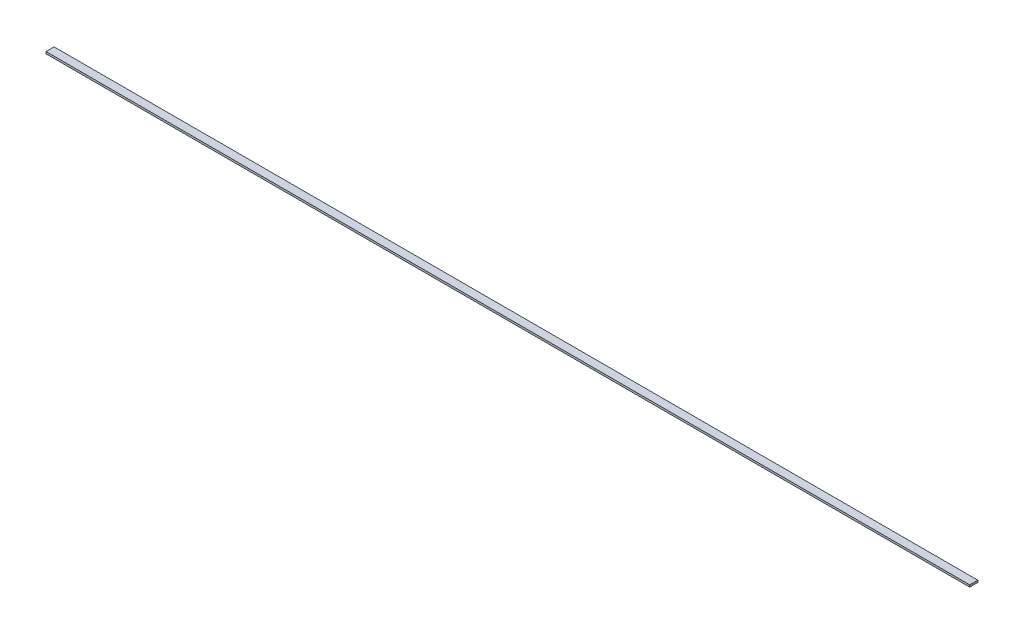
ISO-10303-21;
HEADER;
FILE_DESCRIPTION(('STEP AP214'),'2;1');
FILE_NAME('part.step','',(''),(''),'','','');
FILE_SCHEMA(('AUTOMOTIVE_DESIGN { 1 0 10303 214 1 1 1 1 }'));
ENDSEC;
DATA;
#1=APPLICATION_CONTEXT('core data for automotive mechanical design processes');
#2=APPLICATION_PROTOCOL_DEFINITION('international standard','automotive_design',2000,#1);
#3=PRODUCT_CONTEXT('',#1,'mechanical');
#4=PRODUCT('Part','Part','',(#3));
#5=PRODUCT_RELATED_PRODUCT_CATEGORY('part','',(#4));
#6=PRODUCT_DEFINITION_FORMATION('','',#4);
#7=PRODUCT_DEFINITION_CONTEXT('part definition',#1,'design');
#8=PRODUCT_DEFINITION('design','',#6,#7);
#9=PRODUCT_DEFINITION_SHAPE('','',#8);
#10=(LENGTH_UNIT() NAMED_UNIT(*) SI_UNIT(.MILLI.,.METRE.));
#11=(NAMED_UNIT(*) PLANE_ANGLE_UNIT() SI_UNIT($,.RADIAN.));
#12=(NAMED_UNIT(*) SI_UNIT($,.STERADIAN.) SOLID_ANGLE_UNIT());
#13=UNCERTAINTY_MEASURE_WITH_UNIT(LENGTH_MEASURE(1.E-05),#10,'distance_accuracy_value','');
#14=(GEOMETRIC_REPRESENTATION_CONTEXT(3) GLOBAL_UNCERTAINTY_ASSIGNED_CONTEXT((#13)) GLOBAL_UNIT_ASSIGNED_CONTEXT((#10,
#11,#12)) REPRESENTATION_CONTEXT('',''));
#15=CARTESIAN_POINT('',(0.,0.,0.));
#16=DIRECTION('',(0.,0.,1.));
#17=DIRECTION('',(1.,0.,0.));
#18=AXIS2_PLACEMENT_3D('',#15,#16,#17);
#19=CARTESIAN_POINT('',(0.,1.49711132773622,0.435092083404368));
#20=DIRECTION('',(-1.,0.,0.));
#21=DIRECTION('',(0.,0.,1.));
#22=AXIS2_PLACEMENT_3D('',#19,#20,#21);
#23=PLANE('',#22);
#24=CARTESIAN_POINT('',(0.,0.,250.));
#25=CARTESIAN_POINT('',(0.,-0.0080427959719715,250.000228293678));
#26=CARTESIAN_POINT('',(0.,0.172375657967406,248.284955515532));
#27=CARTESIAN_POINT('',(0.,0.308690014795419,246.518112419387));
#28=CARTESIAN_POINT('',(0.,0.685693593852336,242.189387343398));
#29=CARTESIAN_POINT('',(0.,1.07410152891603,236.806461263496));
#30=CARTESIAN_POINT('',(0.,1.49731723995003,229.680385951639));
#31=CARTESIAN_POINT('',(0.,1.8232186026768,221.18415869828));
#32=CARTESIAN_POINT('',(0.,1.96762610068065,211.337618207726));
#33=CARTESIAN_POINT('',(0.,1.83322105638369,200.371188527109));
#34=CARTESIAN_POINT('',(0.,1.38960528984164,188.499913622482));
#35=CARTESIAN_POINT('',(0.,0.706014078000893,175.953687417433));
#36=CARTESIAN_POINT('',(0.,-0.160208641561513,162.931424917666));
#37=CARTESIAN_POINT('',(0.,-1.14801632724376,149.615771743617));
#38=CARTESIAN_POINT('',(0.,-2.19092490983926,136.176354994724));
#39=CARTESIAN_POINT('',(0.,-3.21958397917046,122.767140548026));
#40=CARTESIAN_POINT('',(0.,-4.15274312671142,109.520053587455));
#41=CARTESIAN_POINT('',(0.,-4.93856436487493,96.5460959745437));
#42=CARTESIAN_POINT('',(0.,-5.53683070268675,83.9408193016427));
#43=CARTESIAN_POINT('',(0.,-5.94764820461108,71.8018392906514));
#44=CARTESIAN_POINT('',(0.,-6.21845093878312,60.2452560030716));
#45=CARTESIAN_POINT('',(0.,-6.35536975583973,49.3987328907547));
#46=CARTESIAN_POINT('',(0.,-6.38138796281789,39.3972261942655));
#47=CARTESIAN_POINT('',(0.,-6.26504923032313,30.3619348419668));
#48=CARTESIAN_POINT('',(0.,-6.01216491688521,22.4121811031587));
#49=CARTESIAN_POINT('',(0.,-5.59743390072595,15.6262272306516));
#50=CARTESIAN_POINT('',(0.,-4.92870657935606,10.0719075109048));
#51=CARTESIAN_POINT('',(0.,-4.04044698146404,5.69769261214423));
#52=CARTESIAN_POINT('',(0.,-2.8657529844069,2.62532063874475));
#53=CARTESIAN_POINT('',(0.,-1.7115284699546,0.494884225045661));
#54=CARTESIAN_POINT('',(0.,-0.410454230626488,-0.0213125491030087));
#55=CARTESIAN_POINT('',(0.,0.792659826704065,0.0311691995850224));
#56=CARTESIAN_POINT('',(0.,2.30568433693192,0.812599241892923));
#57=CARTESIAN_POINT('',(0.,4.23835242447377,2.72886351673443));
#58=CARTESIAN_POINT('',(0.,6.11817212106947,5.76990724125498));
#59=CARTESIAN_POINT('',(0.,7.91359420170391,9.88094280419771));
#60=CARTESIAN_POINT('',(0.,9.64131817838287,15.0749304677094));
#61=CARTESIAN_POINT('',(0.,11.2838964878058,21.2987522216172));
#62=CARTESIAN_POINT('',(0.,12.7883817585812,28.4971721202648));
#63=CARTESIAN_POINT('',(0.,14.0978349081275,36.6073734062479));
#64=CARTESIAN_POINT('',(0.,15.1594290171638,45.573028440303));
#65=CARTESIAN_POINT('',(0.,15.9609039979753,55.3329100744701));
#66=CARTESIAN_POINT('',(0.,16.4940697383882,65.8165364983871));
#67=CARTESIAN_POINT('',(0.,16.7919897051422,76.9313762604552));
#68=CARTESIAN_POINT('',(0.,16.864754130909,88.5669490281142));
#69=CARTESIAN_POINT('',(0.,16.7267152914356,100.596999885542));
#70=CARTESIAN_POINT('',(0.,16.3833850637257,112.888825982424));
#71=CARTESIAN_POINT('',(0.,15.825573666627,125.31161581915));
#72=CARTESIAN_POINT('',(0.,15.0523318700684,137.743791097076));
#73=CARTESIAN_POINT('',(0.,14.0593390742259,150.072384382085));
#74=CARTESIAN_POINT('',(0.,12.8815869860292,162.191375055682));
#75=CARTESIAN_POINT('',(0.,11.5492803460744,173.989074322246));
#76=CARTESIAN_POINT('',(0.,10.1162497290333,185.35236444642));
#77=CARTESIAN_POINT('',(0.,8.63237912523508,196.163081697706));
#78=CARTESIAN_POINT('',(0.,7.13151388385034,206.300441402258));
#79=CARTESIAN_POINT('',(0.,5.73122176805054,215.560350587015));
#80=CARTESIAN_POINT('',(0.,4.29329512716244,223.97715704258));
#81=CARTESIAN_POINT('',(0.,3.1818088737293,231.363413336396));
#82=CARTESIAN_POINT('',(0.,2.09894241729889,237.746440904332));
#83=CARTESIAN_POINT('',(0.,1.2458619166603,242.622069365861));
#84=CARTESIAN_POINT('',(0.,0.552864946230777,246.64452933247));
#85=CARTESIAN_POINT('',(0.,0.246216764640028,248.328398440367));
#86=CARTESIAN_POINT('',(0.,0.00797737724443801,249.999773563223));
#87=CARTESIAN_POINT('',(0.,0.,250.));
#88=B_SPLINE_CURVE_WITH_KNOTS('',3,(#24,#25,#26,#27,#28,#29,#30,#31,#32,#33,#34,#35,#36,#37,#38,
#39,#40,#41,#42,#43,#44,#45,#46,#47,#48,#49,#50,#51,#52,#53,#54,#55,#56,#57,#58,#59,#60,#61,#62,
#63,#64,#65,#66,#67,#68,#69,#70,#71,#72,#73,#74,#75,#76,#77,#78,#79,#80,#81,#82,#83,#84,#85,#86,
#87),.UNSPECIFIED.,.T.,.F.,(4,1,1,1,1,1,1,1,1,1,1,1,1,1,1,1,1,1,1,1,1,1,1,1,1,1,1,1,1,1,1,1,1,1,
1,1,1,1,1,1,1,1,1,1,1,1,1,1,1,1,1,1,1,1,1,1,1,1,1,1,1,4),(0.,0.00158888881614516,
0.00632921783555629,0.0142024564897436,0.0251728077530557,0.0391734833267743,0.0560606311759249,
0.0755789238487882,0.0973636066296903,0.120926258366677,0.145825281006277,0.171670911815127,
0.198108536705041,0.22479018357162,0.25139057978404,0.277643490654311,0.303326750051388,
0.328257458029316,0.352272548115194,0.375156061746876,0.396620664402003,0.416422729294005,
0.434304420097656,0.450054679859308,0.463465465082325,0.474478994238096,0.483169222153171,
0.489678354497499,0.494104066315722,0.496910015324886,0.497289784891853,0.501214273282496,
0.506457950332762,0.51335695674223,0.522168631834455,0.53296596992453,0.545689209241574,
0.56022077890382,0.57643892310517,0.594258689005965,0.613600244568652,0.634342385932902,
0.656331109263004,0.679351893859712,0.703152302846811,0.727478208080039,0.7520707394079,
0.776691163534608,0.801140183976245,0.825214386971546,0.848697423570622,0.871352857669295,
0.892947448931157,0.913230871058069,0.931955467148994,0.94834206907442,0.963693004275676,
0.976235918239566,0.986320058750392,0.993788799349345,0.998424034933867,1.),.UNSPECIFIED.);
#89=CARTESIAN_POINT('',(0.,-1.00001216278874,0.266541428387411));
#90=VERTEX_POINT('',#89);
#91=CARTESIAN_POINT('',(0.,0.999987837209787,0.201511969330149));
#92=VERTEX_POINT('',#91);
#93=EDGE_CURVE('E11',#90,#92,#88,.T.);
#94=ORIENTED_EDGE('',*,*,#93,.F.);
#95=DIRECTION('',(0.,0.,-1.));
#96=VECTOR('',#95,1.);
#97=CARTESIAN_POINT('',(0.,-1.00001216278875,8.19991970488098));
#98=LINE('',#97,#96);
#99=CARTESIAN_POINT('',(0.,-1.00001216278875,8.19991970488098));
#100=VERTEX_POINT('',#99);
#101=EDGE_CURVE('E69',#100,#90,#98,.T.);
#102=ORIENTED_EDGE('',*,*,#101,.F.);
#103=DIRECTION('',(0.,-1.,0.));
#104=VECTOR('',#103,1.);
#105=CARTESIAN_POINT('',(0.,0.999987837211251,8.19991970488098));
#106=LINE('',#105,#104);
#107=CARTESIAN_POINT('',(0.,0.999987837211251,8.19991970488098));
#108=VERTEX_POINT('',#107);
#109=EDGE_CURVE('E88',#108,#100,#106,.T.);
#110=ORIENTED_EDGE('',*,*,#109,.F.);
#111=DIRECTION('',(0.,0.,1.));
#112=VECTOR('',#111,1.);
#113=CARTESIAN_POINT('',(0.,0.999987837211251,8.19991970488098));
#114=LINE('',#113,#112);
#115=EDGE_CURVE('E125',#92,#108,#114,.T.);
#116=ORIENTED_EDGE('',*,*,#115,.F.);
#117=EDGE_LOOP('',(#94,#102,#110,#116));
#118=FACE_BOUND('',#117,.T.);
#119=ADVANCED_FACE('F34',(#118),#23,.T.);
#120=CARTESIAN_POINT('',(5.,0.,250.));
#121=CARTESIAN_POINT('',(5.,-0.0080427959719715,250.000228293678));
#122=CARTESIAN_POINT('',(5.,0.172375657967406,248.284955515532));
#123=CARTESIAN_POINT('',(5.,0.308690014795419,246.518112419387));
#124=CARTESIAN_POINT('',(5.,0.685693593852336,242.189387343398));
#125=CARTESIAN_POINT('',(5.,1.07410152891603,236.806461263496));
#126=CARTESIAN_POINT('',(5.,1.49731723995003,229.680385951639));
#127=CARTESIAN_POINT('',(5.,1.8232186026768,221.18415869828));
#128=CARTESIAN_POINT('',(5.,1.96762610068065,211.337618207726));
#129=CARTESIAN_POINT('',(5.,1.83322105638369,200.371188527109));
#130=CARTESIAN_POINT('',(5.,1.38960528984164,188.499913622482));
#131=CARTESIAN_POINT('',(5.,0.706014078000893,175.953687417433));
#132=CARTESIAN_POINT('',(5.,-0.160208641561513,162.931424917666));
#133=CARTESIAN_POINT('',(5.,-1.14801632724376,149.615771743617));
#134=CARTESIAN_POINT('',(5.,-2.19092490983926,136.176354994724));
#135=CARTESIAN_POINT('',(5.,-3.21958397917046,122.767140548026));
#136=CARTESIAN_POINT('',(5.,-4.15274312671142,109.520053587455));
#137=CARTESIAN_POINT('',(5.,-4.93856436487493,96.5460959745437));
#138=CARTESIAN_POINT('',(5.,-5.53683070268675,83.9408193016427));
#139=CARTESIAN_POINT('',(5.,-5.94764820461108,71.8018392906514));
#140=CARTESIAN_POINT('',(5.,-6.21845093878312,60.2452560030716));
#141=CARTESIAN_POINT('',(5.,-6.35536975583973,49.3987328907547));
#142=CARTESIAN_POINT('',(5.,-6.38138796281789,39.3972261942655));
#143=CARTESIAN_POINT('',(5.,-6.26504923032313,30.3619348419668));
#144=CARTESIAN_POINT('',(5.,-6.01216491688521,22.4121811031587));
#145=CARTESIAN_POINT('',(5.,-5.59743390072595,15.6262272306516));
#146=CARTESIAN_POINT('',(5.,-4.92870657935606,10.0719075109048));
#147=CARTESIAN_POINT('',(5.,-4.04044698146404,5.69769261214423));
#148=CARTESIAN_POINT('',(5.,-2.8657529844069,2.62532063874475));
#149=CARTESIAN_POINT('',(5.,-1.7115284699546,0.494884225045661));
#150=CARTESIAN_POINT('',(5.,-0.410454230626488,-0.0213125491030087));
#151=CARTESIAN_POINT('',(5.,0.792659826704065,0.0311691995850224));
#152=CARTESIAN_POINT('',(5.,2.30568433693192,0.812599241892923));
#153=CARTESIAN_POINT('',(5.,4.23835242447377,2.72886351673443));
#154=CARTESIAN_POINT('',(5.,6.11817212106947,5.76990724125498));
#155=CARTESIAN_POINT('',(5.,7.91359420170391,9.88094280419771));
#156=CARTESIAN_POINT('',(5.,9.64131817838287,15.0749304677094));
#157=CARTESIAN_POINT('',(5.,11.2838964878058,21.2987522216172));
#158=CARTESIAN_POINT('',(5.,12.7883817585812,28.4971721202648));
#159=CARTESIAN_POINT('',(5.,14.0978349081275,36.6073734062479));
#160=CARTESIAN_POINT('',(5.,15.1594290171638,45.573028440303));
#161=CARTESIAN_POINT('',(5.,15.9609039979753,55.3329100744701));
#162=CARTESIAN_POINT('',(5.,16.4940697383882,65.8165364983871));
#163=CARTESIAN_POINT('',(5.,16.7919897051422,76.9313762604552));
#164=CARTESIAN_POINT('',(5.,16.864754130909,88.5669490281142));
#165=CARTESIAN_POINT('',(5.,16.7267152914356,100.596999885542));
#166=CARTESIAN_POINT('',(5.,16.3833850637257,112.888825982424));
#167=CARTESIAN_POINT('',(5.,15.825573666627,125.31161581915));
#168=CARTESIAN_POINT('',(5.,15.0523318700684,137.743791097076));
#169=CARTESIAN_POINT('',(5.,14.0593390742259,150.072384382085));
#170=CARTESIAN_POINT('',(5.,12.8815869860292,162.191375055682));
#171=CARTESIAN_POINT('',(5.,11.5492803460744,173.989074322246));
#172=CARTESIAN_POINT('',(5.,10.1162497290333,185.35236444642));
#173=CARTESIAN_POINT('',(5.,8.63237912523508,196.163081697706));
#174=CARTESIAN_POINT('',(5.,7.13151388385034,206.300441402258));
#175=CARTESIAN_POINT('',(5.,5.73122176805054,215.560350587015));
#176=CARTESIAN_POINT('',(5.,4.29329512716244,223.97715704258));
#177=CARTESIAN_POINT('',(5.,3.1818088737293,231.363413336396));
#178=CARTESIAN_POINT('',(5.,2.09894241729889,237.746440904332));
#179=CARTESIAN_POINT('',(5.,1.2458619166603,242.622069365861));
#180=CARTESIAN_POINT('',(5.,0.552864946230777,246.64452933247));
#181=CARTESIAN_POINT('',(5.,0.246216764640028,248.328398440367));
#182=CARTESIAN_POINT('',(5.,0.00797737724443801,249.999773563223));
#183=CARTESIAN_POINT('',(5.,0.,250.));
#184=B_SPLINE_CURVE_WITH_KNOTS('',3,(#120,#121,#122,#123,#124,#125,#126,#127,#128,#129,#130,
#131,#132,#133,#134,#135,#136,#137,#138,#139,#140,#141,#142,#143,#144,#145,#146,#147,#148,#149,
#150,#151,#152,#153,#154,#155,#156,#157,#158,#159,#160,#161,#162,#163,#164,#165,#166,#167,#168,
#169,#170,#171,#172,#173,#174,#175,#176,#177,#178,#179,#180,#181,#182,#183),.UNSPECIFIED.,.T.,
.F.,(4,1,1,1,1,1,1,1,1,1,1,1,1,1,1,1,1,1,1,1,1,1,1,1,1,1,1,1,1,1,1,1,1,1,1,1,1,1,1,1,1,1,1,1,1,
1,1,1,1,1,1,1,1,1,1,1,1,1,1,1,1,4),(0.,0.00158888881614516,0.00632921783555629,
0.0142024564897436,0.0251728077530557,0.0391734833267743,0.0560606311759249,0.0755789238487882,
0.0973636066296903,0.120926258366677,0.145825281006277,0.171670911815127,0.198108536705041,
0.22479018357162,0.25139057978404,0.277643490654311,0.303326750051388,0.328257458029316,
0.352272548115194,0.375156061746876,0.396620664402003,0.416422729294005,0.434304420097656,
0.450054679859308,0.463465465082325,0.474478994238096,0.483169222153171,0.489678354497499,
0.494104066315722,0.496910015324886,0.497289784891853,0.501214273282496,0.506457950332762,
0.51335695674223,0.522168631834455,0.53296596992453,0.545689209241574,0.56022077890382,
0.57643892310517,0.594258689005965,0.613600244568652,0.634342385932902,0.656331109263004,
0.679351893859712,0.703152302846811,0.727478208080039,0.7520707394079,0.776691163534608,
0.801140183976245,0.825214386971546,0.848697423570622,0.871352857669295,0.892947448931157,
0.913230871058069,0.931955467148994,0.94834206907442,0.963693004275676,0.976235918239566,
0.986320058750392,0.993788799349345,0.998424034933867,1.),.UNSPECIFIED.);
#185=DIRECTION('',(-1.,0.,0.));
#186=VECTOR('',#185,1.);
#187=SURFACE_OF_LINEAR_EXTRUSION('',#184,#186);
#188=DIRECTION('',(-1.,0.,0.));
#189=VECTOR('',#188,1.);
#190=CARTESIAN_POINT('',(2.5,-1.00001216278874,0.266541428387411));
#191=LINE('',#190,#189);
#192=CARTESIAN_POINT('',(915.,-1.00001216278864,0.266541428387357));
#193=VERTEX_POINT('',#192);
#194=EDGE_CURVE('E80',#90,#193,#191,.F.);
#195=ORIENTED_EDGE('',*,*,#194,.F.);
#196=ORIENTED_EDGE('',*,*,#93,.T.);
#197=DIRECTION('',(-1.,0.,0.));
#198=VECTOR('',#197,1.);
#199=CARTESIAN_POINT('',(2.5,0.999987837211269,0.201511969330724));
#200=LINE('',#199,#198);
#201=CARTESIAN_POINT('',(915.,0.999987837210289,0.201511969330344));
#202=VERTEX_POINT('',#201);
#203=EDGE_CURVE('E52',#92,#202,#200,.F.);
#204=ORIENTED_EDGE('',*,*,#203,.T.);
#205=CARTESIAN_POINT('',(915.,-1.00001216278864,0.266541428387357));
#206=CARTESIAN_POINT('',(915.,-0.96352854643699,0.24739636345769));
#207=CARTESIAN_POINT('',(915.,-0.926583590938244,0.229124480074609));
#208=CARTESIAN_POINT('',(915.,-0.851788545044796,0.194394820209712));
#209=CARTESIAN_POINT('',(915.,-0.813937265806537,0.177939605491571));
#210=CARTESIAN_POINT('',(915.,-0.737430451592456,0.146957307169961));
#211=CARTESIAN_POINT('',(915.,-0.698774533117779,0.13243116850468));
#212=CARTESIAN_POINT('',(915.,-0.621146378982343,0.105562193098103));
#213=CARTESIAN_POINT('',(915.,-0.582181257604548,0.0931988278713369));
#214=CARTESIAN_POINT('',(915.,-0.503650112550171,0.0706001608430065));
#215=CARTESIAN_POINT('',(915.,-0.464084301229766,0.0603641249568602));
#216=CARTESIAN_POINT('',(915.,-0.384447924589305,0.0421458779926837));
#217=CARTESIAN_POINT('',(915.,-0.344377454093007,0.0341632499169644));
#218=CARTESIAN_POINT('',(915.,-0.243082034002305,0.0170951854629961));
#219=CARTESIAN_POINT('',(915.,-0.181582490849863,0.00955625990358863));
#220=CARTESIAN_POINT('',(915.,-0.0890245478732348,0.00272742579941516));
#221=CARTESIAN_POINT('',(915.,-0.0581168723712811,0.00119782233074786));
#222=CARTESIAN_POINT('',(915.,0.00373820184295657,-0.000285710361649545));
#223=CARTESIAN_POINT('',(915.,0.0346855992619639,-0.000239689645806044));
#224=CARTESIAN_POINT('',(915.,0.096629856029956,0.00130635941642704));
#225=CARTESIAN_POINT('',(915.,0.127626597772657,0.00281061268642056));
#226=CARTESIAN_POINT('',(915.,0.18953687044619,0.00704801214719235));
#227=CARTESIAN_POINT('',(915.,0.220450392905355,0.00978127902079081));
#228=CARTESIAN_POINT('',(915.,0.282164426709342,0.0163904863433376));
#229=CARTESIAN_POINT('',(915.,0.312964900416234,0.0202667775943579));
#230=CARTESIAN_POINT('',(915.,0.374401670074106,0.0291298958696311));
#231=CARTESIAN_POINT('',(915.,0.405037980689386,0.0341166219489025));
#232=CARTESIAN_POINT('',(915.,0.483966177562081,0.0483771399907087));
#233=CARTESIAN_POINT('',(915.,0.532114744218726,0.0584533607457297));
#234=CARTESIAN_POINT('',(915.,0.627806191878603,0.0810742880715991));
#235=CARTESIAN_POINT('',(915.,0.675349271638863,0.0936181611470678));
#236=CARTESIAN_POINT('',(915.,0.769477127757297,0.120887860618115));
#237=CARTESIAN_POINT('',(915.,0.816066056117364,0.135599431922584));
#238=CARTESIAN_POINT('',(915.,0.908555446437478,0.167069416042817));
#239=CARTESIAN_POINT('',(915.,0.954455818896606,0.183828092403938));
#240=CARTESIAN_POINT('',(915.,0.999987837210289,0.201511969330344));
#241=B_SPLINE_CURVE_WITH_KNOTS('',3,(#205,#206,#207,#208,#209,#210,#211,#212,#213,#214,#215,
#216,#217,#218,#219,#220,#221,#222,#223,#224,#225,#226,#227,#228,#229,#230,#231,#232,#233,#234,
#235,#236,#237,#238,#239,#240),.UNSPECIFIED.,.F.,.F.,(4,2,2,2,2,2,2,2,2,2,2,2,2,2,2,2,2,4),(0.,
0.123597636389655,0.247367395053568,0.371197559184267,0.493779728094001,0.616319526676095,
0.738836634132249,0.924402957077513,1.01720757164637,1.11000923764772,1.20308058312431,
1.29616106972522,1.38927015315551,1.48237077588171,1.62987028319633,1.77732005509186,
1.92384020541569,2.07037923873888),.UNSPECIFIED.);
#242=EDGE_CURVE('E95',#193,#202,#241,.T.);
#243=ORIENTED_EDGE('',*,*,#242,.F.);
#244=EDGE_LOOP('',(#195,#196,#204,#243));
#245=FACE_BOUND('',#244,.T.);
#246=ADVANCED_FACE('F36',(#245),#187,.F.);
#247=CARTESIAN_POINT('',(0.,-1.00001216278875,8.19991970488098));
#248=DIRECTION('',(0.,-1.,0.));
#249=DIRECTION('',(0.,0.,-1.));
#250=AXIS2_PLACEMENT_3D('',#247,#248,#249);
#251=PLANE('',#250);
#252=ORIENTED_EDGE('',*,*,#194,.T.);
#253=DIRECTION('',(0.,0.,-1.));
#254=VECTOR('',#253,1.);
#255=CARTESIAN_POINT('',(915.,-1.00001216278875,8.19991970488098));
#256=LINE('',#255,#254);
#257=CARTESIAN_POINT('',(915.,-1.00001216278875,8.19991970488098));
#258=VERTEX_POINT('',#257);
#259=EDGE_CURVE('E90',#258,#193,#256,.T.);
#260=ORIENTED_EDGE('',*,*,#259,.F.);
#261=DIRECTION('',(1.,0.,0.));
#262=VECTOR('',#261,1.);
#263=CARTESIAN_POINT('',(0.,-1.00001216278875,8.19991970488098));
#264=LINE('',#263,#262);
#265=EDGE_CURVE('E45',#100,#258,#264,.T.);
#266=ORIENTED_EDGE('',*,*,#265,.F.);
#267=ORIENTED_EDGE('',*,*,#101,.T.);
#268=EDGE_LOOP('',(#252,#260,#266,#267));
#269=FACE_BOUND('',#268,.T.);
#270=ADVANCED_FACE('F91',(#269),#251,.T.);
#271=CARTESIAN_POINT('',(0.,0.999987837211251,8.19991970488098));
#272=DIRECTION('',(0.,0.,1.));
#273=DIRECTION('',(1.,0.,0.));
#274=AXIS2_PLACEMENT_3D('',#271,#272,#273);
#275=PLANE('',#274);
#276=ORIENTED_EDGE('',*,*,#265,.T.);
#277=DIRECTION('',(0.,-1.,0.));
#278=VECTOR('',#277,1.);
#279=CARTESIAN_POINT('',(915.,0.999987837211251,8.19991970488098));
#280=LINE('',#279,#278);
#281=CARTESIAN_POINT('',(915.,0.999987837211251,8.19991970488098));
#282=VERTEX_POINT('',#281);
#283=EDGE_CURVE('E86',#282,#258,#280,.T.);
#284=ORIENTED_EDGE('',*,*,#283,.F.);
#285=DIRECTION('',(1.,0.,0.));
#286=VECTOR('',#285,1.);
#287=CARTESIAN_POINT('',(0.,0.999987837211251,8.19991970488098));
#288=LINE('',#287,#286);
#289=EDGE_CURVE('E74',#108,#282,#288,.T.);
#290=ORIENTED_EDGE('',*,*,#289,.F.);
#291=ORIENTED_EDGE('',*,*,#109,.T.);
#292=EDGE_LOOP('',(#276,#284,#290,#291));
#293=FACE_BOUND('',#292,.T.);
#294=ADVANCED_FACE('F84',(#293),#275,.T.);
#295=CARTESIAN_POINT('',(0.,0.999987837211251,8.19991970488098));
#296=DIRECTION('',(0.,1.,0.));
#297=DIRECTION('',(0.,0.,1.));
#298=AXIS2_PLACEMENT_3D('',#295,#296,#297);
#299=PLANE('',#298);
#300=ORIENTED_EDGE('',*,*,#289,.T.);
#301=DIRECTION('',(0.,-1.27879993536302E-13,1.));
#302=VECTOR('',#301,1.);
#303=CARTESIAN_POINT('',(915.,0.999987837212274,0.201511969331115));
#304=LINE('',#303,#302);
#305=EDGE_CURVE('E98',#202,#282,#304,.T.);
#306=ORIENTED_EDGE('',*,*,#305,.F.);
#307=ORIENTED_EDGE('',*,*,#203,.F.);
#308=ORIENTED_EDGE('',*,*,#115,.T.);
#309=EDGE_LOOP('',(#300,#306,#307,#308));
#310=FACE_BOUND('',#309,.T.);
#311=ADVANCED_FACE('F112',(#310),#299,.T.);
#312=CARTESIAN_POINT('',(915.,-0.00117875197038139,1.13976059152579E-05));
#313=DIRECTION('',(-1.,0.,0.));
#314=DIRECTION('',(0.,0.,1.));
#315=AXIS2_PLACEMENT_3D('',#312,#313,#314);
#316=PLANE('',#315);
#317=ORIENTED_EDGE('',*,*,#283,.T.);
#318=ORIENTED_EDGE('',*,*,#259,.T.);
#319=ORIENTED_EDGE('',*,*,#242,.T.);
#320=ORIENTED_EDGE('',*,*,#305,.T.);
#321=EDGE_LOOP('',(#317,#318,#319,#320));
#322=FACE_BOUND('',#321,.T.);
#323=ADVANCED_FACE('F97',(#322),#316,.F.);
#324=CLOSED_SHELL('',(#119,#246,#270,#294,#311,#323));
#325=MANIFOLD_SOLID_BREP('B2',#324);
#326=ADVANCED_BREP_SHAPE_REPRESENTATION('',(#18,#325),#14);
#327=SHAPE_DEFINITION_REPRESENTATION(#9,#326);
ENDSEC;
END-ISO-10303-21;
